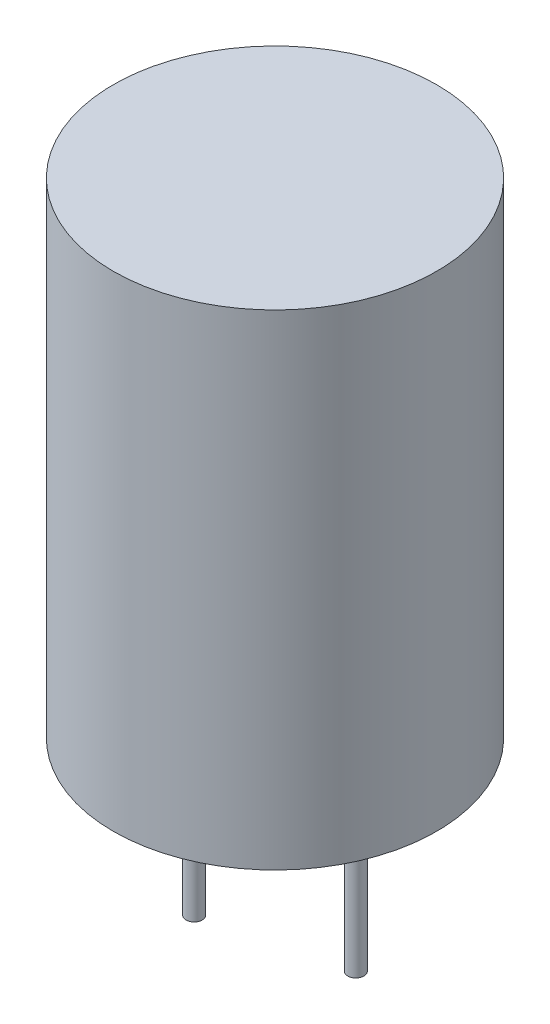
ISO-10303-21;
HEADER;
FILE_DESCRIPTION(('STEP AP214'),'2;1');
FILE_NAME('part.step','',(''),(''),'','','');
FILE_SCHEMA(('AUTOMOTIVE_DESIGN { 1 0 10303 214 1 1 1 1 }'));
ENDSEC;
DATA;
#1=APPLICATION_CONTEXT('core data for automotive mechanical design processes');
#2=APPLICATION_PROTOCOL_DEFINITION('international standard','automotive_design',2000,#1);
#3=PRODUCT_CONTEXT('',#1,'mechanical');
#4=PRODUCT('Part','Part','',(#3));
#5=PRODUCT_RELATED_PRODUCT_CATEGORY('part','',(#4));
#6=PRODUCT_DEFINITION_FORMATION('','',#4);
#7=PRODUCT_DEFINITION_CONTEXT('part definition',#1,'design');
#8=PRODUCT_DEFINITION('design','',#6,#7);
#9=PRODUCT_DEFINITION_SHAPE('','',#8);
#10=(LENGTH_UNIT() NAMED_UNIT(*) SI_UNIT(.MILLI.,.METRE.));
#11=(NAMED_UNIT(*) PLANE_ANGLE_UNIT() SI_UNIT($,.RADIAN.));
#12=(NAMED_UNIT(*) SI_UNIT($,.STERADIAN.) SOLID_ANGLE_UNIT());
#13=UNCERTAINTY_MEASURE_WITH_UNIT(LENGTH_MEASURE(1.E-05),#10,'distance_accuracy_value','');
#14=(GEOMETRIC_REPRESENTATION_CONTEXT(3) GLOBAL_UNCERTAINTY_ASSIGNED_CONTEXT((#13)) GLOBAL_UNIT_ASSIGNED_CONTEXT((#10,
#11,#12)) REPRESENTATION_CONTEXT('',''));
#15=CARTESIAN_POINT('',(0.,0.,0.));
#16=DIRECTION('',(0.,0.,1.));
#17=DIRECTION('',(1.,0.,0.));
#18=AXIS2_PLACEMENT_3D('',#15,#16,#17);
#19=CARTESIAN_POINT('',(0.,0.,0.));
#20=DIRECTION('',(0.,1.,0.));
#21=DIRECTION('',(0.,0.,1.));
#22=AXIS2_PLACEMENT_3D('',#19,#20,#21);
#23=PLANE('',#22);
#24=CARTESIAN_POINT('',(-5.,0.,0.));
#25=DIRECTION('',(0.,1.,0.));
#26=DIRECTION('',(0.,0.,1.));
#27=AXIS2_PLACEMENT_3D('',#24,#25,#26);
#28=CIRCLE('',#27,0.5);
#29=CARTESIAN_POINT('',(-5.,0.,0.5));
#30=VERTEX_POINT('',#29);
#31=EDGE_CURVE('E34',#30,#30,#28,.F.);
#32=ORIENTED_EDGE('',*,*,#31,.F.);
#33=EDGE_LOOP('',(#32));
#34=FACE_BOUND('',#33,.T.);
#35=CARTESIAN_POINT('',(0.,0.,0.));
#36=DIRECTION('',(0.,1.,0.));
#37=DIRECTION('',(0.,0.,1.));
#38=AXIS2_PLACEMENT_3D('',#35,#36,#37);
#39=CIRCLE('',#38,10.);
#40=CARTESIAN_POINT('',(0.,0.,10.));
#41=VERTEX_POINT('',#40);
#42=EDGE_CURVE('E42',#41,#41,#39,.T.);
#43=ORIENTED_EDGE('',*,*,#42,.F.);
#44=EDGE_LOOP('',(#43));
#45=FACE_BOUND('',#44,.T.);
#46=CARTESIAN_POINT('',(5.,0.,0.));
#47=DIRECTION('',(0.,1.,0.));
#48=DIRECTION('',(0.,0.,1.));
#49=AXIS2_PLACEMENT_3D('',#46,#47,#48);
#50=CIRCLE('',#49,0.500000000000001);
#51=CARTESIAN_POINT('',(5.,0.,0.500000000000001));
#52=VERTEX_POINT('',#51);
#53=EDGE_CURVE('E10',#52,#52,#50,.F.);
#54=ORIENTED_EDGE('',*,*,#53,.F.);
#55=EDGE_LOOP('',(#54));
#56=FACE_BOUND('',#55,.T.);
#57=ADVANCED_FACE('F27',(#34,#45,#56),#23,.F.);
#58=CARTESIAN_POINT('',(0.,30.,0.));
#59=DIRECTION('',(0.,-1.,0.));
#60=DIRECTION('',(0.,0.,-1.));
#61=AXIS2_PLACEMENT_3D('',#58,#59,#60);
#62=CYLINDRICAL_SURFACE('',#61,10.);
#63=CARTESIAN_POINT('',(0.,30.,0.));
#64=DIRECTION('',(0.,1.,0.));
#65=DIRECTION('',(0.,0.,1.));
#66=AXIS2_PLACEMENT_3D('',#63,#64,#65);
#67=CIRCLE('',#66,10.);
#68=CARTESIAN_POINT('',(0.,30.,10.));
#69=VERTEX_POINT('',#68);
#70=EDGE_CURVE('E38',#69,#69,#67,.T.);
#71=ORIENTED_EDGE('',*,*,#70,.F.);
#72=EDGE_LOOP('',(#71));
#73=FACE_BOUND('',#72,.T.);
#74=ORIENTED_EDGE('',*,*,#42,.T.);
#75=EDGE_LOOP('',(#74));
#76=FACE_BOUND('',#75,.T.);
#77=ADVANCED_FACE('F29',(#73,#76),#62,.T.);
#78=CARTESIAN_POINT('',(0.,30.,0.));
#79=DIRECTION('',(0.,1.,0.));
#80=DIRECTION('',(0.,0.,1.));
#81=AXIS2_PLACEMENT_3D('',#78,#79,#80);
#82=PLANE('',#81);
#83=ORIENTED_EDGE('',*,*,#70,.T.);
#84=EDGE_LOOP('',(#83));
#85=FACE_BOUND('',#84,.T.);
#86=ADVANCED_FACE('F74',(#85),#82,.T.);
#87=CARTESIAN_POINT('',(-5.,-12.,0.));
#88=DIRECTION('',(0.,1.,0.));
#89=DIRECTION('',(0.,0.,1.));
#90=AXIS2_PLACEMENT_3D('',#87,#88,#89);
#91=CYLINDRICAL_SURFACE('',#90,0.5);
#92=CARTESIAN_POINT('',(-5.,-12.,0.));
#93=DIRECTION('',(0.,-1.,0.));
#94=DIRECTION('',(0.,0.,-1.));
#95=AXIS2_PLACEMENT_3D('',#92,#93,#94);
#96=CIRCLE('',#95,0.5);
#97=CARTESIAN_POINT('',(-5.,-12.,-0.5));
#98=VERTEX_POINT('',#97);
#99=EDGE_CURVE('E47',#98,#98,#96,.T.);
#100=ORIENTED_EDGE('',*,*,#99,.F.);
#101=EDGE_LOOP('',(#100));
#102=FACE_BOUND('',#101,.T.);
#103=ORIENTED_EDGE('',*,*,#31,.T.);
#104=EDGE_LOOP('',(#103));
#105=FACE_BOUND('',#104,.T.);
#106=ADVANCED_FACE('F66',(#102,#105),#91,.T.);
#107=CARTESIAN_POINT('',(-5.,-12.,0.));
#108=DIRECTION('',(0.,-1.,0.));
#109=DIRECTION('',(0.,0.,-1.));
#110=AXIS2_PLACEMENT_3D('',#107,#108,#109);
#111=PLANE('',#110);
#112=ORIENTED_EDGE('',*,*,#99,.T.);
#113=EDGE_LOOP('',(#112));
#114=FACE_BOUND('',#113,.T.);
#115=ADVANCED_FACE('F58',(#114),#111,.T.);
#116=CARTESIAN_POINT('',(5.,-10.,0.));
#117=DIRECTION('',(0.,1.,0.));
#118=DIRECTION('',(0.,0.,1.));
#119=AXIS2_PLACEMENT_3D('',#116,#117,#118);
#120=CYLINDRICAL_SURFACE('',#119,0.500000000000001);
#121=CARTESIAN_POINT('',(5.,-10.,0.));
#122=DIRECTION('',(0.,-1.,0.));
#123=DIRECTION('',(0.,0.,-1.));
#124=AXIS2_PLACEMENT_3D('',#121,#122,#123);
#125=CIRCLE('',#124,0.500000000000001);
#126=CARTESIAN_POINT('',(5.,-10.,-0.500000000000001));
#127=VERTEX_POINT('',#126);
#128=EDGE_CURVE('E50',#127,#127,#125,.T.);
#129=ORIENTED_EDGE('',*,*,#128,.F.);
#130=EDGE_LOOP('',(#129));
#131=FACE_BOUND('',#130,.T.);
#132=ORIENTED_EDGE('',*,*,#53,.T.);
#133=EDGE_LOOP('',(#132));
#134=FACE_BOUND('',#133,.T.);
#135=ADVANCED_FACE('F56',(#131,#134),#120,.T.);
#136=CARTESIAN_POINT('',(5.,-10.,0.));
#137=DIRECTION('',(0.,-1.,0.));
#138=DIRECTION('',(0.,0.,-1.));
#139=AXIS2_PLACEMENT_3D('',#136,#137,#138);
#140=PLANE('',#139);
#141=ORIENTED_EDGE('',*,*,#128,.T.);
#142=EDGE_LOOP('',(#141));
#143=FACE_BOUND('',#142,.T.);
#144=ADVANCED_FACE('F54',(#143),#140,.T.);
#145=CLOSED_SHELL('',(#57,#77,#86,#106,#115,#135,#144));
#146=MANIFOLD_SOLID_BREP('B2',#145);
#147=ADVANCED_BREP_SHAPE_REPRESENTATION('',(#18,#146),#14);
#148=SHAPE_DEFINITION_REPRESENTATION(#9,#147);
ENDSEC;
END-ISO-10303-21;
